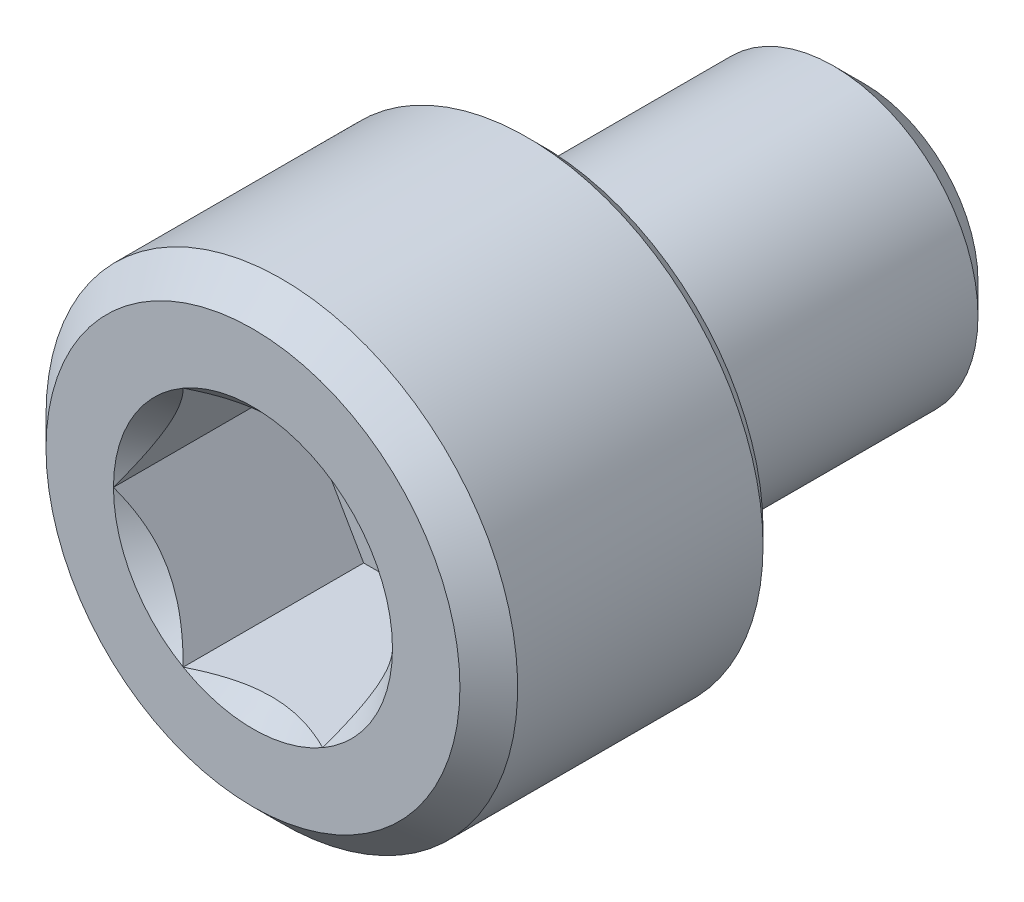
ISO-10303-21;
HEADER;
FILE_DESCRIPTION(('STEP AP214'),'2;1');
FILE_NAME('part.step','',(''),(''),'','','');
FILE_SCHEMA(('AUTOMOTIVE_DESIGN { 1 0 10303 214 1 1 1 1 }'));
ENDSEC;
DATA;
#1=APPLICATION_CONTEXT('core data for automotive mechanical design processes');
#2=APPLICATION_PROTOCOL_DEFINITION('international standard','automotive_design',2000,#1);
#3=PRODUCT_CONTEXT('',#1,'mechanical');
#4=PRODUCT('Part','Part','',(#3));
#5=PRODUCT_RELATED_PRODUCT_CATEGORY('part','',(#4));
#6=PRODUCT_DEFINITION_FORMATION('','',#4);
#7=PRODUCT_DEFINITION_CONTEXT('part definition',#1,'design');
#8=PRODUCT_DEFINITION('design','',#6,#7);
#9=PRODUCT_DEFINITION_SHAPE('','',#8);
#10=(LENGTH_UNIT() NAMED_UNIT(*) SI_UNIT(.MILLI.,.METRE.));
#11=(NAMED_UNIT(*) PLANE_ANGLE_UNIT() SI_UNIT($,.RADIAN.));
#12=(NAMED_UNIT(*) SI_UNIT($,.STERADIAN.) SOLID_ANGLE_UNIT());
#13=UNCERTAINTY_MEASURE_WITH_UNIT(LENGTH_MEASURE(1.E-05),#10,'distance_accuracy_value','');
#14=(GEOMETRIC_REPRESENTATION_CONTEXT(3) GLOBAL_UNCERTAINTY_ASSIGNED_CONTEXT((#13)) GLOBAL_UNIT_ASSIGNED_CONTEXT((#10,
#11,#12)) REPRESENTATION_CONTEXT('',''));
#15=CARTESIAN_POINT('',(0.,0.,0.));
#16=DIRECTION('',(0.,0.,1.));
#17=DIRECTION('',(1.,0.,0.));
#18=AXIS2_PLACEMENT_3D('',#15,#16,#17);
#19=CARTESIAN_POINT('',(-0.687407664253929,-1.19062500000001,4.2418));
#20=DIRECTION('',(0.,-1.,0.));
#21=DIRECTION('',(1.,0.,0.));
#22=AXIS2_PLACEMENT_3D('',#19,#20,#21);
#23=PLANE('',#22);
#24=CARTESIAN_POINT('',(0.687407664277294,-1.1906249999896,6.01979999994058));
#25=CARTESIAN_POINT('',(0.640154592159621,-1.19062499999626,5.99619613526875));
#26=CARTESIAN_POINT('',(0.592111444426228,-1.19062499999901,5.97397879629961));
#27=CARTESIAN_POINT('',(0.494146535924736,-1.19062500000102,5.93329979724913));
#28=CARTESIAN_POINT('',(0.444215463779578,-1.19062500000028,5.91486076355443));
#29=CARTESIAN_POINT('',(0.343531912524057,-1.19062499999975,5.88327457059264));
#30=CARTESIAN_POINT('',(0.292805060555605,-1.19062499999994,5.87004804212517));
#31=CARTESIAN_POINT('',(0.190234889449796,-1.19062500000008,5.84967007141222));
#32=CARTESIAN_POINT('',(0.138394701495093,-1.19062500000003,5.8425034234336));
#33=CARTESIAN_POINT('',(0.0490434169882952,-1.190625,5.8360368684392));
#34=CARTESIAN_POINT('',(0.0116476310552699,-1.19062500000001,5.83507994966179));
#35=CARTESIAN_POINT('',(-0.0630781171094954,-1.19062500000002,5.83669472917782));
#36=CARTESIAN_POINT('',(-0.100408062977307,-1.19062500000001,5.83926720693277));
#37=CARTESIAN_POINT('',(-0.174707551009404,-1.19062500000001,5.84779207154897));
#38=CARTESIAN_POINT('',(-0.211676725476661,-1.19062500000001,5.85374760134521));
#39=CARTESIAN_POINT('',(-0.284997831230871,-1.19062500000001,5.86871782115586));
#40=CARTESIAN_POINT('',(-0.321349490620918,-1.19062500000001,5.87773382384566));
#41=CARTESIAN_POINT('',(-0.41440940795511,-1.19062500000001,5.90447923586494));
#42=CARTESIAN_POINT('',(-0.470532059309204,-1.19062500000001,5.92421600119337));
#43=CARTESIAN_POINT('',(-0.580581647542152,-1.19062500000001,5.96867313927323));
#44=CARTESIAN_POINT('',(-0.634515062306383,-1.19062500000001,5.99337728917765));
#45=CARTESIAN_POINT('',(-0.687407664278694,-1.19062500000001,6.01979999993563));
#46=B_SPLINE_CURVE_WITH_KNOTS('',3,(#24,#25,#26,#27,#28,#29,#30,#31,#32,#33,#34,#35,#36,#37,#38,
#39,#40,#41,#42,#43,#44,#45),.UNSPECIFIED.,.F.,.F.,(4,2,2,2,2,2,2,2,2,2,4),(0.,
0.158570945809826,0.318065397882605,0.475027617348499,0.631594801178747,0.743660160911235,
0.855750274081425,0.967944692312765,1.08018729307609,1.25836291055874,1.43596581387088),.UNSPECIFIED.);
#47=CARTESIAN_POINT('',(0.68740766426033,-1.19062500001114,6.01979999993603));
#48=VERTEX_POINT('',#47);
#49=CARTESIAN_POINT('',(-0.687407664261738,-1.19062500000863,6.01979999993462));
#50=VERTEX_POINT('',#49);
#51=EDGE_CURVE('E20',#48,#50,#46,.T.);
#52=ORIENTED_EDGE('',*,*,#51,.F.);
#53=DIRECTION('',(0.,0.,1.));
#54=VECTOR('',#53,1.);
#55=CARTESIAN_POINT('',(0.68740766425391,-1.19062500000005,4.24179999999998));
#56=LINE('',#55,#54);
#57=CARTESIAN_POINT('',(0.687407664253914,-1.19062500000002,4.24179999999999));
#58=VERTEX_POINT('',#57);
#59=EDGE_CURVE('E103',#48,#58,#56,.F.);
#60=ORIENTED_EDGE('',*,*,#59,.T.);
#61=DIRECTION('',(1.,0.,0.));
#62=VECTOR('',#61,1.);
#63=CARTESIAN_POINT('',(-0.687407664253929,-1.19062500000001,4.2418));
#64=LINE('',#63,#62);
#65=CARTESIAN_POINT('',(-0.68740766425391,-1.19062500000001,4.24179999999999));
#66=VERTEX_POINT('',#65);
#67=EDGE_CURVE('E77',#66,#58,#64,.T.);
#68=ORIENTED_EDGE('',*,*,#67,.F.);
#69=DIRECTION('',(0.,0.,1.));
#70=VECTOR('',#69,1.);
#71=CARTESIAN_POINT('',(-0.687407664253898,-1.190625,4.24179999999999));
#72=LINE('',#71,#70);
#73=EDGE_CURVE('E76',#66,#50,#72,.T.);
#74=ORIENTED_EDGE('',*,*,#73,.T.);
#75=EDGE_LOOP('',(#52,#60,#68,#74));
#76=FACE_BOUND('',#75,.T.);
#77=ADVANCED_FACE('F16',(#76),#23,.F.);
#78=CARTESIAN_POINT('',(-1.37481532850778,0.,4.24179999999999));
#79=DIRECTION('',(-0.866025403784439,-0.499999999999999,0.));
#80=DIRECTION('',(0.499999999999999,-0.866025403784439,0.));
#81=AXIS2_PLACEMENT_3D('',#78,#79,#80);
#82=PLANE('',#81);
#83=CARTESIAN_POINT('',(-0.687407664233176,-1.19062500001505,6.01979999994063));
#84=CARTESIAN_POINT('',(-0.711034200291528,-1.14970263916847,5.99619613526782));
#85=CARTESIAN_POINT('',(-0.7350557741543,-1.10809605276586,5.97397879629719));
#86=CARTESIAN_POINT('',(-0.784038228394201,-1.02325595334697,5.93329979724235));
#87=CARTESIAN_POINT('',(-0.809003764459844,-0.980014376441599,5.91486076354477));
#88=CARTESIAN_POINT('',(-0.859345540074889,-0.892819863332041,5.88327457057553));
#89=CARTESIAN_POINT('',(-0.884708966053326,-0.848889120883765,5.87004804210353));
#90=CARTESIAN_POINT('',(-0.93599405159474,-0.7600607470558,5.84967007137995));
#91=CARTESIAN_POINT('',(-0.96191414556639,-0.715165827359833,5.84250342339523));
#92=CARTESIAN_POINT('',(-1.00658978780666,-0.637785345138859,5.83603686838997));
#93=CARTESIAN_POINT('',(-1.0252876807656,-0.605399644539514,5.83507994960736));
#94=CARTESIAN_POINT('',(-1.0626505548331,-0.540685248337811,5.83669472911132));
#95=CARTESIAN_POINT('',(-1.08131552775971,-0.50835656690703,5.8392672068594));
#96=CARTESIAN_POINT('',(-1.11846527176149,-0.444011322807768,5.84779207146064));
#97=CARTESIAN_POINT('',(-1.13694985898815,-0.411995078574251,5.85374760124879));
#98=CARTESIAN_POINT('',(-1.17361041185163,-0.348497138381132,5.86871782104254));
#99=CARTESIAN_POINT('',(-1.19178624154,-0.317015677891157,5.87773382372354));
#100=CARTESIAN_POINT('',(-1.2383162002291,-0.236423425367555,5.90447923574199));
#101=CARTESIAN_POINT('',(-1.26637752593366,-0.187819783519514,5.92421600108724));
#102=CARTESIAN_POINT('',(-1.32140232010286,-0.0925140443424555,5.96867313921265));
#103=CARTESIAN_POINT('',(-1.34836902751017,-0.0458063370001356,5.99337728914579));
#104=CARTESIAN_POINT('',(-1.37481532852016,2.14135467923374E-11,6.01979999993566));
#105=B_SPLINE_CURVE_WITH_KNOTS('',3,(#83,#84,#85,#86,#87,#88,#89,#90,#91,#92,#93,#94,#95,#96,
#97,#98,#99,#100,#101,#102,#103,#104),.UNSPECIFIED.,.F.,.F.,(4,2,2,2,2,2,2,2,2,2,4),(0.,
0.158570945777479,0.318065397817903,0.475027617252742,0.631594801051958,0.743660160739462,
0.855750273864614,0.967944692050859,1.08018729276907,1.258362910423,1.43596581390698),.UNSPECIFIED.);
#106=CARTESIAN_POINT('',(-1.37481532851913,2.42978214211457E-12,6.01979999993463));
#107=VERTEX_POINT('',#106);
#108=EDGE_CURVE('E84',#50,#107,#105,.T.);
#109=ORIENTED_EDGE('',*,*,#108,.F.);
#110=ORIENTED_EDGE('',*,*,#73,.F.);
#111=DIRECTION('',(0.499999999999977,-0.866025403784452,0.));
#112=VECTOR('',#111,1.);
#113=CARTESIAN_POINT('',(-1.37481532850778,0.,4.2418));
#114=LINE('',#113,#112);
#115=CARTESIAN_POINT('',(-1.37481532850775,0.,4.2418));
#116=VERTEX_POINT('',#115);
#117=EDGE_CURVE('E267',#116,#66,#114,.T.);
#118=ORIENTED_EDGE('',*,*,#117,.F.);
#119=DIRECTION('',(0.,0.,1.));
#120=VECTOR('',#119,1.);
#121=CARTESIAN_POINT('',(-1.37481532850773,0.,4.2418));
#122=LINE('',#121,#120);
#123=EDGE_CURVE('E102',#116,#107,#122,.T.);
#124=ORIENTED_EDGE('',*,*,#123,.T.);
#125=EDGE_LOOP('',(#109,#110,#118,#124));
#126=FACE_BOUND('',#125,.T.);
#127=ADVANCED_FACE('F100',(#126),#82,.F.);
#128=CARTESIAN_POINT('',(0.687407664253904,-1.19062500000006,4.24179999999998));
#129=DIRECTION('',(0.866025403784439,-0.5,0.));
#130=DIRECTION('',(0.5,0.866025403784439,0.));
#131=AXIS2_PLACEMENT_3D('',#128,#129,#130);
#132=PLANE('',#131);
#133=CARTESIAN_POINT('',(1.37481532851047,2.54237097222163E-11,6.0197999999406));
#134=CARTESIAN_POINT('',(1.35118879246368,-0.0409223608278323,5.99619613526779));
#135=CARTESIAN_POINT('',(1.32716721860566,-0.0825289472331829,5.97397879629716));
#136=CARTESIAN_POINT('',(1.27818476436925,-0.167369046654096,5.93329979724231));
#137=CARTESIAN_POINT('',(1.25321922830232,-0.210610623558728,5.91486076354473));
#138=CARTESIAN_POINT('',(1.20287745268634,-0.297805136667759,5.88327457057548));
#139=CARTESIAN_POINT('',(1.17751402670824,-0.341735879116232,5.87004804210348));
#140=CARTESIAN_POINT('',(1.12622894116707,-0.430564252944345,5.84967007137989));
#141=CARTESIAN_POINT('',(1.10030884719532,-0.47545917264026,5.84250342339517));
#142=CARTESIAN_POINT('',(1.055633204955,-0.55283965486121,5.8360368683899));
#143=CARTESIAN_POINT('',(1.03693531199608,-0.585225355460561,5.8350799496073));
#144=CARTESIAN_POINT('',(0.999572437928589,-0.649939751662267,5.83669472911126));
#145=CARTESIAN_POINT('',(0.980907465001982,-0.682268433093044,5.83926720685934));
#146=CARTESIAN_POINT('',(0.943757721000201,-0.746613677192302,5.84779207146057));
#147=CARTESIAN_POINT('',(0.925273133773541,-0.778629921425818,5.85374760124872));
#148=CARTESIAN_POINT('',(0.888612580910059,-0.842127861618934,5.86871782104247));
#149=CARTESIAN_POINT('',(0.87043675122169,-0.873609322108908,5.87773382372347));
#150=CARTESIAN_POINT('',(0.823906792532585,-0.954201574632518,5.90447923574192));
#151=CARTESIAN_POINT('',(0.795845466828017,-1.00280521648057,5.92421600108717));
#152=CARTESIAN_POINT('',(0.740820672658817,-1.09811095565764,5.96867313921259));
#153=CARTESIAN_POINT('',(0.713853965251494,-1.14481866299997,5.99337728914574));
#154=CARTESIAN_POINT('',(0.687407664241507,-1.19062500002153,6.01979999993561));
#155=B_SPLINE_CURVE_WITH_KNOTS('',3,(#133,#134,#135,#136,#137,#138,#139,#140,#141,#142,#143,
#144,#145,#146,#147,#148,#149,#150,#151,#152,#153,#154),.UNSPECIFIED.,.F.,.F.,(4,2,2,2,2,2,2,2,
2,2,4),(0.,0.158570945777492,0.318065397817929,0.47502761725278,0.631594801052009,
0.743660160739508,0.855750273864654,0.967944692050895,1.0801872927691,1.25836291042306,
1.43596581390707),.UNSPECIFIED.);
#156=CARTESIAN_POINT('',(1.37481532852065,0.,6.01979999993604));
#157=VERTEX_POINT('',#156);
#158=EDGE_CURVE('E60',#157,#48,#155,.T.);
#159=ORIENTED_EDGE('',*,*,#158,.F.);
#160=DIRECTION('',(0.,0.,1.));
#161=VECTOR('',#160,1.);
#162=CARTESIAN_POINT('',(1.37481532850783,0.,4.2418));
#163=LINE('',#162,#161);
#164=CARTESIAN_POINT('',(1.37481532850783,0.,4.2418));
#165=VERTEX_POINT('',#164);
#166=EDGE_CURVE('E248',#157,#165,#163,.F.);
#167=ORIENTED_EDGE('',*,*,#166,.T.);
#168=DIRECTION('',(0.500000000000009,0.866025403784433,0.));
#169=VECTOR('',#168,1.);
#170=CARTESIAN_POINT('',(0.687407664253904,-1.19062500000006,4.2418));
#171=LINE('',#170,#169);
#172=EDGE_CURVE('E271',#58,#165,#171,.T.);
#173=ORIENTED_EDGE('',*,*,#172,.F.);
#174=ORIENTED_EDGE('',*,*,#59,.F.);
#175=EDGE_LOOP('',(#159,#167,#173,#174));
#176=FACE_BOUND('',#175,.T.);
#177=ADVANCED_FACE('F121',(#176),#132,.F.);
#178=CARTESIAN_POINT('',(0.,0.,4.2418));
#179=DIRECTION('',(0.,0.,1.));
#180=DIRECTION('',(1.,0.,0.));
#181=AXIS2_PLACEMENT_3D('',#178,#179,#180);
#182=PLANE('',#181);
#183=ORIENTED_EDGE('',*,*,#117,.T.);
#184=ORIENTED_EDGE('',*,*,#67,.T.);
#185=ORIENTED_EDGE('',*,*,#172,.T.);
#186=DIRECTION('',(-0.499999999999999,0.866025403784439,0.));
#187=VECTOR('',#186,1.);
#188=CARTESIAN_POINT('',(1.37481532850784,0.,4.2418));
#189=LINE('',#188,#187);
#190=CARTESIAN_POINT('',(0.687407664253934,1.19062499999998,4.24179999999999));
#191=VERTEX_POINT('',#190);
#192=EDGE_CURVE('E143',#165,#191,#189,.T.);
#193=ORIENTED_EDGE('',*,*,#192,.T.);
#194=DIRECTION('',(-1.,0.,0.));
#195=VECTOR('',#194,1.);
#196=CARTESIAN_POINT('',(0.687407664253934,1.19062499999997,4.24179999999998));
#197=LINE('',#196,#195);
#198=CARTESIAN_POINT('',(-0.687407664253818,1.19062499999998,4.24179999999999));
#199=VERTEX_POINT('',#198);
#200=EDGE_CURVE('E245',#191,#199,#197,.T.);
#201=ORIENTED_EDGE('',*,*,#200,.T.);
#202=DIRECTION('',(-0.5,-0.866025403784439,0.));
#203=VECTOR('',#202,1.);
#204=CARTESIAN_POINT('',(-0.687407664253818,1.19062499999997,4.2418));
#205=LINE('',#204,#203);
#206=EDGE_CURVE('E262',#199,#116,#205,.T.);
#207=ORIENTED_EDGE('',*,*,#206,.T.);
#208=EDGE_LOOP('',(#183,#184,#185,#193,#201,#207));
#209=FACE_BOUND('',#208,.T.);
#210=ADVANCED_FACE('F125',(#209),#182,.T.);
#211=CARTESIAN_POINT('',(-0.687407664253818,1.19062499999997,4.2418));
#212=DIRECTION('',(-0.866025403784439,0.5,0.));
#213=DIRECTION('',(-0.5,-0.866025403784439,0.));
#214=AXIS2_PLACEMENT_3D('',#211,#212,#213);
#215=PLANE('',#214);
#216=CARTESIAN_POINT('',(-1.37481532851041,-2.55112858589051E-11,6.01979999994063));
#217=CARTESIAN_POINT('',(-1.3511887924636,0.0409223608277424,5.99619613526783));
#218=CARTESIAN_POINT('',(-1.32716721860558,0.0825289472330925,5.97397879629719));
#219=CARTESIAN_POINT('',(-1.27818476436917,0.167369046654007,5.93329979724235));
#220=CARTESIAN_POINT('',(-1.25321922830224,0.210610623558641,5.91486076354476));
#221=CARTESIAN_POINT('',(-1.20287745268626,0.297805136667674,5.88327457057551));
#222=CARTESIAN_POINT('',(-1.17751402670816,0.341735879116148,5.87004804210351));
#223=CARTESIAN_POINT('',(-1.12622894116698,0.430564252944262,5.84967007137992));
#224=CARTESIAN_POINT('',(-1.10030884719524,0.475459172640179,5.8425034233952));
#225=CARTESIAN_POINT('',(-1.05563320495491,0.552839654861131,5.83603686838994));
#226=CARTESIAN_POINT('',(-1.03693531199599,0.585225355460483,5.83507994960734));
#227=CARTESIAN_POINT('',(-0.9995724379285,0.649939751662191,5.8366947291113));
#228=CARTESIAN_POINT('',(-0.980907465001892,0.682268433092969,5.83926720685938));
#229=CARTESIAN_POINT('',(-0.94375772100011,0.74661367719223,5.84779207146061));
#230=CARTESIAN_POINT('',(-0.925273133773449,0.778629921425746,5.85374760124876));
#231=CARTESIAN_POINT('',(-0.888612580909966,0.842127861618865,5.86871782104252));
#232=CARTESIAN_POINT('',(-0.870436751221596,0.87360932210884,5.87773382372351));
#233=CARTESIAN_POINT('',(-0.823906792532495,0.954201574632444,5.90447923574196));
#234=CARTESIAN_POINT('',(-0.795845466827932,1.00280521648049,5.92421600108721));
#235=CARTESIAN_POINT('',(-0.740820672658738,1.09811095565755,5.96867313921262));
#236=CARTESIAN_POINT('',(-0.713853965251419,1.14481866299987,5.99337728914576));
#237=CARTESIAN_POINT('',(-0.687407664241436,1.19062500002142,6.01979999993564));
#238=B_SPLINE_CURVE_WITH_KNOTS('',3,(#216,#217,#218,#219,#220,#221,#222,#223,#224,#225,#226,
#227,#228,#229,#230,#231,#232,#233,#234,#235,#236,#237),.UNSPECIFIED.,.F.,.F.,(4,2,2,2,2,2,2,2,
2,2,4),(0.,0.158570945777495,0.318065397817935,0.47502761725279,0.631594801052023,
0.743660160739526,0.855750273864676,0.96794469205092,1.08018729276913,1.25836291042306,
1.43596581390705),.UNSPECIFIED.);
#239=CARTESIAN_POINT('',(-0.687407664260244,1.19062500001107,6.01979999993607));
#240=VERTEX_POINT('',#239);
#241=EDGE_CURVE('E39',#107,#240,#238,.T.);
#242=ORIENTED_EDGE('',*,*,#241,.F.);
#243=ORIENTED_EDGE('',*,*,#123,.F.);
#244=ORIENTED_EDGE('',*,*,#206,.F.);
#245=DIRECTION('',(0.,0.,1.));
#246=VECTOR('',#245,1.);
#247=CARTESIAN_POINT('',(-0.687407664253818,1.19062499999998,4.24179999999998));
#248=LINE('',#247,#246);
#249=EDGE_CURVE('E241',#199,#240,#248,.T.);
#250=ORIENTED_EDGE('',*,*,#249,.T.);
#251=EDGE_LOOP('',(#242,#243,#244,#250));
#252=FACE_BOUND('',#251,.T.);
#253=ADVANCED_FACE('F129',(#252),#215,.F.);
#254=CARTESIAN_POINT('',(1.37481532850784,0.,4.2418));
#255=DIRECTION('',(0.866025403784439,0.499999999999999,0.));
#256=DIRECTION('',(-0.499999999999999,0.866025403784439,0.));
#257=AXIS2_PLACEMENT_3D('',#254,#255,#256);
#258=PLANE('',#257);
#259=CARTESIAN_POINT('',(0.687407664233227,1.190625000015,6.01979999994066));
#260=CARTESIAN_POINT('',(0.711034200291584,1.14970263916841,5.99619613526784));
#261=CARTESIAN_POINT('',(0.735055774154359,1.10809605276581,5.97397879629721));
#262=CARTESIAN_POINT('',(0.784038228394266,1.02325595334691,5.93329979724236));
#263=CARTESIAN_POINT('',(0.809003764459911,0.980014376441533,5.91486076354477));
#264=CARTESIAN_POINT('',(0.859345540074962,0.892819863331965,5.88327457057552));
#265=CARTESIAN_POINT('',(0.884708966053401,0.848889120883685,5.87004804210352));
#266=CARTESIAN_POINT('',(0.935994051594821,0.760060747055709,5.84967007137993));
#267=CARTESIAN_POINT('',(0.961914145566474,0.715165827359738,5.84250342339521));
#268=CARTESIAN_POINT('',(1.00658978780675,0.637785345138759,5.83603686838995));
#269=CARTESIAN_POINT('',(1.02528768076568,0.605399644539415,5.83507994960734));
#270=CARTESIAN_POINT('',(1.06265055483319,0.540685248337713,5.8366947291113));
#271=CARTESIAN_POINT('',(1.08131552775979,0.508356566906932,5.83926720685938));
#272=CARTESIAN_POINT('',(1.11846527176157,0.44401132280767,5.84779207146061));
#273=CARTESIAN_POINT('',(1.13694985898823,0.411995078574154,5.85374760124876));
#274=CARTESIAN_POINT('',(1.17361041185172,0.348497138381036,5.86871782104252));
#275=CARTESIAN_POINT('',(1.19178624154009,0.317015677891061,5.87773382372351));
#276=CARTESIAN_POINT('',(1.23831620022919,0.236423425367459,5.90447923574196));
#277=CARTESIAN_POINT('',(1.26637752593375,0.18781978351942,5.92421600108721));
#278=CARTESIAN_POINT('',(1.32140232010294,0.0925140443423621,5.96867313921262));
#279=CARTESIAN_POINT('',(1.34836902751026,0.0458063370000426,5.99337728914575));
#280=CARTESIAN_POINT('',(1.37481532852024,-2.15061787172219E-11,6.01979999993562));
#281=B_SPLINE_CURVE_WITH_KNOTS('',3,(#259,#260,#261,#262,#263,#264,#265,#266,#267,#268,#269,
#270,#271,#272,#273,#274,#275,#276,#277,#278,#279,#280),.UNSPECIFIED.,.F.,.F.,(4,2,2,2,2,2,2,2,
2,2,4),(0.,0.158570945777497,0.31806539781794,0.475027617252797,0.631594801052032,
0.743660160739534,0.855750273864684,0.967944692050929,1.08018729276914,1.25836291042306,
1.43596581390704),.UNSPECIFIED.);
#282=CARTESIAN_POINT('',(0.68740766426034,1.19062500001108,6.01979999993608));
#283=VERTEX_POINT('',#282);
#284=EDGE_CURVE('E144',#283,#157,#281,.T.);
#285=ORIENTED_EDGE('',*,*,#284,.F.);
#286=DIRECTION('',(0.,0.,1.));
#287=VECTOR('',#286,1.);
#288=CARTESIAN_POINT('',(0.687407664253933,1.19062499999997,4.24179999999998));
#289=LINE('',#288,#287);
#290=EDGE_CURVE('E238',#283,#191,#289,.F.);
#291=ORIENTED_EDGE('',*,*,#290,.T.);
#292=ORIENTED_EDGE('',*,*,#192,.F.);
#293=ORIENTED_EDGE('',*,*,#166,.F.);
#294=EDGE_LOOP('',(#285,#291,#292,#293));
#295=FACE_BOUND('',#294,.T.);
#296=ADVANCED_FACE('F134',(#295),#258,.F.);
#297=CARTESIAN_POINT('',(0.,0.,0.));
#298=DIRECTION('',(0.,0.,1.));
#299=DIRECTION('',(1.,0.,0.));
#300=AXIS2_PLACEMENT_3D('',#297,#298,#299);
#301=PLANE('',#300);
#302=CARTESIAN_POINT('',(0.,0.,0.));
#303=DIRECTION('',(0.,0.,1.));
#304=DIRECTION('',(1.,0.,0.));
#305=AXIS2_PLACEMENT_3D('',#302,#303,#304);
#306=CIRCLE('',#305,1.12522000006268);
#307=CARTESIAN_POINT('',(1.12522000006265,0.,0.));
#308=VERTEX_POINT('',#307);
#309=EDGE_CURVE('E172',#308,#308,#306,.T.);
#310=ORIENTED_EDGE('',*,*,#309,.F.);
#311=EDGE_LOOP('',(#310));
#312=FACE_BOUND('',#311,.T.);
#313=ADVANCED_FACE('F180',(#312),#301,.F.);
#314=CARTESIAN_POINT('',(0.687407664253934,1.19062499999997,4.24179999999998));
#315=DIRECTION('',(0.,1.,0.));
#316=DIRECTION('',(-1.,0.,0.));
#317=AXIS2_PLACEMENT_3D('',#314,#315,#316);
#318=PLANE('',#317);
#319=CARTESIAN_POINT('',(0.687407664277283,1.19062499998956,6.01979999994064));
#320=CARTESIAN_POINT('',(0.640154592159611,1.19062499999623,5.99619613526881));
#321=CARTESIAN_POINT('',(0.592111444426219,1.19062499999897,5.97397879629967));
#322=CARTESIAN_POINT('',(0.49414653592473,1.19062500000099,5.93329979724919));
#323=CARTESIAN_POINT('',(0.444215463779573,1.19062500000024,5.91486076355449));
#324=CARTESIAN_POINT('',(0.343531912524054,1.19062499999971,5.88327457059271));
#325=CARTESIAN_POINT('',(0.292805060555603,1.19062499999991,5.87004804212524));
#326=CARTESIAN_POINT('',(0.190234889449797,1.19062500000004,5.84967007141229));
#327=CARTESIAN_POINT('',(0.138394701495096,1.19062499999999,5.84250342343367));
#328=CARTESIAN_POINT('',(0.0490434169882974,1.19062499999996,5.83603686843927));
#329=CARTESIAN_POINT('',(0.0116476310552707,1.19062499999997,5.83507994966186));
#330=CARTESIAN_POINT('',(-0.0630781171094973,1.19062499999998,5.83669472917789));
#331=CARTESIAN_POINT('',(-0.100408062977311,1.19062499999998,5.83926720693284));
#332=CARTESIAN_POINT('',(-0.17470755100941,1.19062499999997,5.84779207154904));
#333=CARTESIAN_POINT('',(-0.211676725476669,1.19062499999998,5.85374760134528));
#334=CARTESIAN_POINT('',(-0.284997831230882,1.19062499999998,5.86871782115593));
#335=CARTESIAN_POINT('',(-0.32134949062093,1.19062499999998,5.87773382384573));
#336=CARTESIAN_POINT('',(-0.414409407955109,1.19062499999998,5.904479235865));
#337=CARTESIAN_POINT('',(-0.470532059309189,1.19062499999998,5.92421600119343));
#338=CARTESIAN_POINT('',(-0.58058164754211,1.19062499999998,5.96867313927328));
#339=CARTESIAN_POINT('',(-0.634515062306328,1.19062499999998,5.99337728917769));
#340=CARTESIAN_POINT('',(-0.687407664278627,1.19062499999998,6.01979999993566));
#341=B_SPLINE_CURVE_WITH_KNOTS('',3,(#319,#320,#321,#322,#323,#324,#325,#326,#327,#328,#329,
#330,#331,#332,#333,#334,#335,#336,#337,#338,#339,#340),.UNSPECIFIED.,.F.,.F.,(4,2,2,2,2,2,2,2,
2,2,4),(0.,0.158570945809821,0.318065397882596,0.475027617348486,0.631594801178729,
0.743660160911221,0.855750274081415,0.96794469231276,1.08018729307609,1.2583629105587,
1.43596581387079),.UNSPECIFIED.);
#342=EDGE_CURVE('E163',#283,#240,#341,.T.);
#343=ORIENTED_EDGE('',*,*,#342,.T.);
#344=ORIENTED_EDGE('',*,*,#249,.F.);
#345=ORIENTED_EDGE('',*,*,#200,.F.);
#346=ORIENTED_EDGE('',*,*,#290,.F.);
#347=EDGE_LOOP('',(#343,#344,#345,#346));
#348=FACE_BOUND('',#347,.T.);
#349=ADVANCED_FACE('F175',(#348),#318,.F.);
#350=CARTESIAN_POINT('',(0.,0.,0.297179999961372));
#351=DIRECTION('',(0.,0.,1.));
#352=DIRECTION('',(1.,0.,0.));
#353=AXIS2_PLACEMENT_3D('',#350,#351,#352);
#354=CONICAL_SURFACE('',#353,1.42239999996721,0.78539816330181);
#355=ORIENTED_EDGE('',*,*,#309,.T.);
#356=EDGE_LOOP('',(#355));
#357=FACE_BOUND('',#356,.T.);
#358=CARTESIAN_POINT('',(0.,0.,0.297179999999987));
#359=DIRECTION('',(0.,0.,-1.));
#360=DIRECTION('',(-1.,0.,0.));
#361=AXIS2_PLACEMENT_3D('',#358,#359,#360);
#362=CIRCLE('',#361,1.4224);
#363=CARTESIAN_POINT('',(-1.42239999999994,0.,0.297179999999987));
#364=VERTEX_POINT('',#363);
#365=EDGE_CURVE('E171',#364,#364,#362,.F.);
#366=ORIENTED_EDGE('',*,*,#365,.F.);
#367=EDGE_LOOP('',(#366));
#368=FACE_BOUND('',#367,.T.);
#369=ADVANCED_FACE('F179',(#357,#368),#354,.T.);
#370=CARTESIAN_POINT('',(0.,0.,6.01980000004687));
#371=DIRECTION('',(0.,0.,1.));
#372=DIRECTION('',(1.,0.,0.));
#373=AXIS2_PLACEMENT_3D('',#370,#371,#372);
#374=CONICAL_SURFACE('',#373,1.37481532863143,0.785398163397448);
#375=ORIENTED_EDGE('',*,*,#284,.T.);
#376=CARTESIAN_POINT('',(0.,0.,6.01979999993318));
#377=DIRECTION('',(0.,0.,1.));
#378=DIRECTION('',(1.,0.,0.));
#379=AXIS2_PLACEMENT_3D('',#376,#377,#378);
#380=CIRCLE('',#379,1.37481532851774);
#381=EDGE_CURVE('E173',#283,#157,#380,.F.);
#382=ORIENTED_EDGE('',*,*,#381,.F.);
#383=EDGE_LOOP('',(#375,#382));
#384=FACE_BOUND('',#383,.T.);
#385=ADVANCED_FACE('F298',(#384),#374,.F.);
#386=CARTESIAN_POINT('',(0.,0.,6.01980000004687));
#387=DIRECTION('',(0.,0.,1.));
#388=DIRECTION('',(1.,0.,0.));
#389=AXIS2_PLACEMENT_3D('',#386,#387,#388);
#390=CONICAL_SURFACE('',#389,1.37481532863143,0.785398163397448);
#391=ORIENTED_EDGE('',*,*,#158,.T.);
#392=CARTESIAN_POINT('',(0.,0.,6.01979999993318));
#393=DIRECTION('',(0.,0.,1.));
#394=DIRECTION('',(1.,0.,0.));
#395=AXIS2_PLACEMENT_3D('',#392,#393,#394);
#396=CIRCLE('',#395,1.37481532851774);
#397=EDGE_CURVE('E93',#157,#48,#396,.F.);
#398=ORIENTED_EDGE('',*,*,#397,.F.);
#399=EDGE_LOOP('',(#391,#398));
#400=FACE_BOUND('',#399,.T.);
#401=ADVANCED_FACE('F300',(#400),#390,.F.);
#402=CARTESIAN_POINT('',(0.,0.,6.01980000004687));
#403=DIRECTION('',(0.,0.,1.));
#404=DIRECTION('',(1.,0.,0.));
#405=AXIS2_PLACEMENT_3D('',#402,#403,#404);
#406=CONICAL_SURFACE('',#405,1.37481532863143,0.785398163550833);
#407=ORIENTED_EDGE('',*,*,#51,.T.);
#408=CARTESIAN_POINT('',(0.,0.,6.01979999993318));
#409=DIRECTION('',(0.,0.,1.));
#410=DIRECTION('',(1.,0.,0.));
#411=AXIS2_PLACEMENT_3D('',#408,#409,#410);
#412=CIRCLE('',#411,1.37481532851774);
#413=EDGE_CURVE('E72',#48,#50,#412,.F.);
#414=ORIENTED_EDGE('',*,*,#413,.F.);
#415=EDGE_LOOP('',(#407,#414));
#416=FACE_BOUND('',#415,.T.);
#417=ADVANCED_FACE('F70',(#416),#406,.F.);
#418=CARTESIAN_POINT('',(0.,0.,6.01980000004687));
#419=DIRECTION('',(0.,0.,1.));
#420=DIRECTION('',(1.,0.,0.));
#421=AXIS2_PLACEMENT_3D('',#418,#419,#420);
#422=CONICAL_SURFACE('',#421,1.37481532863143,0.785398163397448);
#423=ORIENTED_EDGE('',*,*,#108,.T.);
#424=CARTESIAN_POINT('',(0.,0.,6.01979999993318));
#425=DIRECTION('',(0.,0.,1.));
#426=DIRECTION('',(1.,0.,0.));
#427=AXIS2_PLACEMENT_3D('',#424,#425,#426);
#428=CIRCLE('',#427,1.37481532851774);
#429=EDGE_CURVE('E91',#50,#107,#428,.F.);
#430=ORIENTED_EDGE('',*,*,#429,.F.);
#431=EDGE_LOOP('',(#423,#430));
#432=FACE_BOUND('',#431,.T.);
#433=ADVANCED_FACE('F96',(#432),#422,.F.);
#434=CARTESIAN_POINT('',(0.,0.,6.01980000004687));
#435=DIRECTION('',(0.,0.,1.));
#436=DIRECTION('',(1.,0.,0.));
#437=AXIS2_PLACEMENT_3D('',#434,#435,#436);
#438=CONICAL_SURFACE('',#437,1.37481532863143,0.785398163397448);
#439=ORIENTED_EDGE('',*,*,#241,.T.);
#440=CARTESIAN_POINT('',(0.,0.,6.01979999993318));
#441=DIRECTION('',(0.,0.,1.));
#442=DIRECTION('',(1.,0.,0.));
#443=AXIS2_PLACEMENT_3D('',#440,#441,#442);
#444=CIRCLE('',#443,1.37481532851774);
#445=EDGE_CURVE('E98',#107,#240,#444,.F.);
#446=ORIENTED_EDGE('',*,*,#445,.F.);
#447=EDGE_LOOP('',(#439,#446));
#448=FACE_BOUND('',#447,.T.);
#449=ADVANCED_FACE('F151',(#448),#438,.F.);
#450=CARTESIAN_POINT('',(0.,0.,6.01980000004687));
#451=DIRECTION('',(0.,0.,1.));
#452=DIRECTION('',(1.,0.,0.));
#453=AXIS2_PLACEMENT_3D('',#450,#451,#452);
#454=CONICAL_SURFACE('',#453,1.37481532863143,0.785398163550826);
#455=ORIENTED_EDGE('',*,*,#342,.F.);
#456=CARTESIAN_POINT('',(0.,0.,6.01979999993318));
#457=DIRECTION('',(0.,0.,1.));
#458=DIRECTION('',(1.,0.,0.));
#459=AXIS2_PLACEMENT_3D('',#456,#457,#458);
#460=CIRCLE('',#459,1.37481532851774);
#461=EDGE_CURVE('E225',#240,#283,#460,.F.);
#462=ORIENTED_EDGE('',*,*,#461,.F.);
#463=EDGE_LOOP('',(#455,#462));
#464=FACE_BOUND('',#463,.T.);
#465=ADVANCED_FACE('F155',(#464),#454,.F.);
#466=CARTESIAN_POINT('',(0.,0.,3.17499999999998));
#467=DIRECTION('',(0.,0.,-1.));
#468=DIRECTION('',(-1.,0.,0.));
#469=AXIS2_PLACEMENT_3D('',#466,#467,#468);
#470=CYLINDRICAL_SURFACE('',#469,1.4224);
#471=CARTESIAN_POINT('',(0.,0.,3.17499999999998));
#472=DIRECTION('',(0.,0.,-1.));
#473=DIRECTION('',(-1.,0.,0.));
#474=AXIS2_PLACEMENT_3D('',#471,#472,#473);
#475=CIRCLE('',#474,1.4224);
#476=CARTESIAN_POINT('',(-1.42239999999994,0.,3.17499999999998));
#477=VERTEX_POINT('',#476);
#478=EDGE_CURVE('E220',#477,#477,#475,.T.);
#479=ORIENTED_EDGE('',*,*,#478,.T.);
#480=EDGE_LOOP('',(#479));
#481=FACE_BOUND('',#480,.T.);
#482=ORIENTED_EDGE('',*,*,#365,.T.);
#483=EDGE_LOOP('',(#482));
#484=FACE_BOUND('',#483,.T.);
#485=ADVANCED_FACE('F159',(#481,#484),#470,.T.);
#486=CARTESIAN_POINT('',(0.,0.,6.01979999999999));
#487=DIRECTION('',(0.,0.,1.));
#488=DIRECTION('',(1.,0.,0.));
#489=AXIS2_PLACEMENT_3D('',#486,#487,#488);
#490=PLANE('',#489);
#491=CARTESIAN_POINT('',(0.,0.,6.01980000004693));
#492=DIRECTION('',(0.,0.,-1.));
#493=DIRECTION('',(-1.,0.,0.));
#494=AXIS2_PLACEMENT_3D('',#491,#492,#493);
#495=CIRCLE('',#494,2.03961999994817);
#496=CARTESIAN_POINT('',(-2.03961999994812,0.,6.01980000004693));
#497=VERTEX_POINT('',#496);
#498=EDGE_CURVE('E218',#497,#497,#495,.T.);
#499=ORIENTED_EDGE('',*,*,#498,.F.);
#500=EDGE_LOOP('',(#499));
#501=FACE_BOUND('',#500,.T.);
#502=ORIENTED_EDGE('',*,*,#445,.T.);
#503=ORIENTED_EDGE('',*,*,#461,.T.);
#504=ORIENTED_EDGE('',*,*,#381,.T.);
#505=ORIENTED_EDGE('',*,*,#397,.T.);
#506=ORIENTED_EDGE('',*,*,#413,.T.);
#507=ORIENTED_EDGE('',*,*,#429,.T.);
#508=EDGE_LOOP('',(#502,#503,#504,#505,#506,#507));
#509=FACE_BOUND('',#508,.T.);
#510=ADVANCED_FACE('F90',(#501,#509),#490,.T.);
#511=CARTESIAN_POINT('',(0.,0.,3.17499999999998));
#512=DIRECTION('',(0.,0.,1.));
#513=DIRECTION('',(1.,0.,0.));
#514=AXIS2_PLACEMENT_3D('',#511,#512,#513);
#515=PLANE('',#514);
#516=ORIENTED_EDGE('',*,*,#478,.F.);
#517=EDGE_LOOP('',(#516));
#518=FACE_BOUND('',#517,.T.);
#519=CARTESIAN_POINT('',(0.,0.,3.17499999994197));
#520=DIRECTION('',(0.,0.,1.));
#521=DIRECTION('',(1.,0.,0.));
#522=AXIS2_PLACEMENT_3D('',#519,#520,#521);
#523=CIRCLE('',#522,2.18186000000736);
#524=CARTESIAN_POINT('',(2.18186000000742,0.,3.17499999994197));
#525=VERTEX_POINT('',#524);
#526=EDGE_CURVE('E219',#525,#525,#523,.T.);
#527=ORIENTED_EDGE('',*,*,#526,.F.);
#528=EDGE_LOOP('',(#527));
#529=FACE_BOUND('',#528,.T.);
#530=ADVANCED_FACE('F206',(#518,#529),#515,.F.);
#531=CARTESIAN_POINT('',(0.,0.,5.73532000004207));
#532=DIRECTION('',(0.,0.,-1.));
#533=DIRECTION('',(-1.,0.,0.));
#534=AXIS2_PLACEMENT_3D('',#531,#532,#533);
#535=CONICAL_SURFACE('',#534,2.32409999995303,0.785398163397448);
#536=ORIENTED_EDGE('',*,*,#498,.T.);
#537=EDGE_LOOP('',(#536));
#538=FACE_BOUND('',#537,.T.);
#539=CARTESIAN_POINT('',(0.,0.,5.73531999999999));
#540=DIRECTION('',(0.,0.,-1.));
#541=DIRECTION('',(-1.,0.,0.));
#542=AXIS2_PLACEMENT_3D('',#539,#540,#541);
#543=CIRCLE('',#542,2.3241);
#544=CARTESIAN_POINT('',(-2.32409999999994,0.,5.73531999999999));
#545=VERTEX_POINT('',#544);
#546=EDGE_CURVE('E31',#545,#545,#543,.T.);
#547=ORIENTED_EDGE('',*,*,#546,.F.);
#548=EDGE_LOOP('',(#547));
#549=FACE_BOUND('',#548,.T.);
#550=ADVANCED_FACE('F198',(#538,#549),#535,.T.);
#551=CARTESIAN_POINT('',(0.,0.,3.31724000005806));
#552=DIRECTION('',(0.,0.,1.));
#553=DIRECTION('',(1.,0.,0.));
#554=AXIS2_PLACEMENT_3D('',#551,#552,#553);
#555=CONICAL_SURFACE('',#554,2.32410000006661,0.785398163197633);
#556=CARTESIAN_POINT('',(0.,0.,3.31724));
#557=DIRECTION('',(0.,0.,-1.));
#558=DIRECTION('',(-1.,0.,0.));
#559=AXIS2_PLACEMENT_3D('',#556,#557,#558);
#560=CIRCLE('',#559,2.3241);
#561=CARTESIAN_POINT('',(-2.32409999999994,0.,3.31724));
#562=VERTEX_POINT('',#561);
#563=EDGE_CURVE('E11',#562,#562,#560,.F.);
#564=ORIENTED_EDGE('',*,*,#563,.F.);
#565=EDGE_LOOP('',(#564));
#566=FACE_BOUND('',#565,.T.);
#567=ORIENTED_EDGE('',*,*,#526,.T.);
#568=EDGE_LOOP('',(#567));
#569=FACE_BOUND('',#568,.T.);
#570=ADVANCED_FACE('F192',(#566,#569),#555,.T.);
#571=CARTESIAN_POINT('',(0.,0.,6.01979999999999));
#572=DIRECTION('',(0.,0.,-1.));
#573=DIRECTION('',(-1.,0.,0.));
#574=AXIS2_PLACEMENT_3D('',#571,#572,#573);
#575=CYLINDRICAL_SURFACE('',#574,2.3241);
#576=ORIENTED_EDGE('',*,*,#546,.T.);
#577=EDGE_LOOP('',(#576));
#578=FACE_BOUND('',#577,.T.);
#579=ORIENTED_EDGE('',*,*,#563,.T.);
#580=EDGE_LOOP('',(#579));
#581=FACE_BOUND('',#580,.T.);
#582=ADVANCED_FACE('F190',(#578,#581),#575,.T.);
#583=CLOSED_SHELL('',(#77,#127,#177,#210,#253,#296,#313,#349,#369,#385,#401,#417,#433,#449,#465,
#485,#510,#530,#550,#570,#582));
#584=MANIFOLD_SOLID_BREP('B1',#583);
#585=ADVANCED_BREP_SHAPE_REPRESENTATION('',(#18,#584),#14);
#586=SHAPE_DEFINITION_REPRESENTATION(#9,#585);
ENDSEC;
END-ISO-10303-21;
